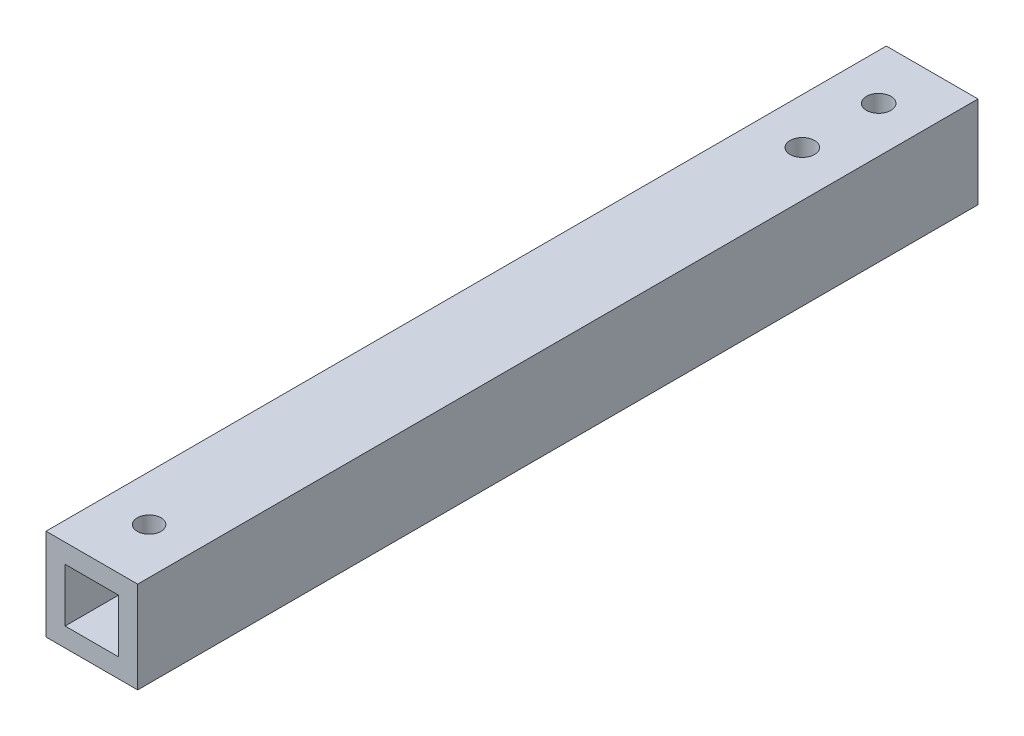
ISO-10303-21;
HEADER;
FILE_DESCRIPTION(('STEP AP214'),'2;1');
FILE_NAME('part.step','',(''),(''),'','','');
FILE_SCHEMA(('AUTOMOTIVE_DESIGN { 1 0 10303 214 1 1 1 1 }'));
ENDSEC;
DATA;
#1=APPLICATION_CONTEXT('core data for automotive mechanical design processes');
#2=APPLICATION_PROTOCOL_DEFINITION('international standard','automotive_design',2000,#1);
#3=PRODUCT_CONTEXT('',#1,'mechanical');
#4=PRODUCT('Part','Part','',(#3));
#5=PRODUCT_RELATED_PRODUCT_CATEGORY('part','',(#4));
#6=PRODUCT_DEFINITION_FORMATION('','',#4);
#7=PRODUCT_DEFINITION_CONTEXT('part definition',#1,'design');
#8=PRODUCT_DEFINITION('design','',#6,#7);
#9=PRODUCT_DEFINITION_SHAPE('','',#8);
#10=(LENGTH_UNIT() NAMED_UNIT(*) SI_UNIT(.MILLI.,.METRE.));
#11=(NAMED_UNIT(*) PLANE_ANGLE_UNIT() SI_UNIT($,.RADIAN.));
#12=(NAMED_UNIT(*) SI_UNIT($,.STERADIAN.) SOLID_ANGLE_UNIT());
#13=UNCERTAINTY_MEASURE_WITH_UNIT(LENGTH_MEASURE(1.E-05),#10,'distance_accuracy_value','');
#14=(GEOMETRIC_REPRESENTATION_CONTEXT(3) GLOBAL_UNCERTAINTY_ASSIGNED_CONTEXT((#13)) GLOBAL_UNIT_ASSIGNED_CONTEXT((#10,
#11,#12)) REPRESENTATION_CONTEXT('',''));
#15=CARTESIAN_POINT('',(0.,0.,0.));
#16=DIRECTION('',(0.,0.,1.));
#17=DIRECTION('',(1.,0.,0.));
#18=AXIS2_PLACEMENT_3D('',#15,#16,#17);
#19=CARTESIAN_POINT('',(6.,-6.,110.));
#20=DIRECTION('',(-1.,0.,0.));
#21=DIRECTION('',(0.,0.,1.));
#22=AXIS2_PLACEMENT_3D('',#19,#20,#21);
#23=PLANE('',#22);
#24=DIRECTION('',(0.,1.,0.));
#25=VECTOR('',#24,1.);
#26=CARTESIAN_POINT('',(6.,-6.,0.));
#27=LINE('',#26,#25);
#28=CARTESIAN_POINT('',(6.,-6.,0.));
#29=VERTEX_POINT('',#28);
#30=CARTESIAN_POINT('',(6.,6.,0.));
#31=VERTEX_POINT('',#30);
#32=EDGE_CURVE('E152',#29,#31,#27,.T.);
#33=ORIENTED_EDGE('',*,*,#32,.T.);
#34=DIRECTION('',(0.,0.,-1.));
#35=VECTOR('',#34,1.);
#36=CARTESIAN_POINT('',(6.,6.,110.));
#37=LINE('',#36,#35);
#38=CARTESIAN_POINT('',(6.,6.,110.));
#39=VERTEX_POINT('',#38);
#40=EDGE_CURVE('E11',#39,#31,#37,.T.);
#41=ORIENTED_EDGE('',*,*,#40,.F.);
#42=DIRECTION('',(0.,1.,0.));
#43=VECTOR('',#42,1.);
#44=CARTESIAN_POINT('',(6.,-6.,110.));
#45=LINE('',#44,#43);
#46=CARTESIAN_POINT('',(6.,-6.,110.));
#47=VERTEX_POINT('',#46);
#48=EDGE_CURVE('E158',#47,#39,#45,.T.);
#49=ORIENTED_EDGE('',*,*,#48,.F.);
#50=DIRECTION('',(0.,0.,-1.));
#51=VECTOR('',#50,1.);
#52=CARTESIAN_POINT('',(6.,-6.,110.));
#53=LINE('',#52,#51);
#54=EDGE_CURVE('E172',#47,#29,#53,.T.);
#55=ORIENTED_EDGE('',*,*,#54,.T.);
#56=EDGE_LOOP('',(#33,#41,#49,#55));
#57=FACE_BOUND('',#56,.T.);
#58=ADVANCED_FACE('F39',(#57),#23,.F.);
#59=CARTESIAN_POINT('',(-6.,6.,110.));
#60=DIRECTION('',(0.,-1.,0.));
#61=DIRECTION('',(0.,0.,-1.));
#62=AXIS2_PLACEMENT_3D('',#59,#60,#61);
#63=PLANE('',#62);
#64=CARTESIAN_POINT('',(0.,6.,7.));
#65=DIRECTION('',(0.,-1.,0.));
#66=DIRECTION('',(0.,0.,-1.));
#67=AXIS2_PLACEMENT_3D('',#64,#65,#66);
#68=CIRCLE('',#67,1.6);
#69=CARTESIAN_POINT('',(0.,6.,5.4));
#70=VERTEX_POINT('',#69);
#71=EDGE_CURVE('E198',#70,#70,#68,.T.);
#72=ORIENTED_EDGE('',*,*,#71,.T.);
#73=EDGE_LOOP('',(#72));
#74=FACE_BOUND('',#73,.T.);
#75=CARTESIAN_POINT('',(0.,6.,17.));
#76=DIRECTION('',(0.,-1.,0.));
#77=DIRECTION('',(0.,0.,-1.));
#78=AXIS2_PLACEMENT_3D('',#75,#76,#77);
#79=CIRCLE('',#78,1.6);
#80=CARTESIAN_POINT('',(0.,6.,15.4));
#81=VERTEX_POINT('',#80);
#82=EDGE_CURVE('E225',#81,#81,#79,.T.);
#83=ORIENTED_EDGE('',*,*,#82,.T.);
#84=EDGE_LOOP('',(#83));
#85=FACE_BOUND('',#84,.T.);
#86=CARTESIAN_POINT('',(0.,6.,102.5));
#87=DIRECTION('',(0.,-1.,0.));
#88=DIRECTION('',(0.,0.,-1.));
#89=AXIS2_PLACEMENT_3D('',#86,#87,#88);
#90=CIRCLE('',#89,1.55);
#91=CARTESIAN_POINT('',(0.,6.,100.95));
#92=VERTEX_POINT('',#91);
#93=EDGE_CURVE('E217',#92,#92,#90,.T.);
#94=ORIENTED_EDGE('',*,*,#93,.T.);
#95=EDGE_LOOP('',(#94));
#96=FACE_BOUND('',#95,.T.);
#97=DIRECTION('',(-1.,0.,0.));
#98=VECTOR('',#97,1.);
#99=CARTESIAN_POINT('',(-6.,6.,0.));
#100=LINE('',#99,#98);
#101=CARTESIAN_POINT('',(-6.,6.,0.));
#102=VERTEX_POINT('',#101);
#103=EDGE_CURVE('E176',#31,#102,#100,.T.);
#104=ORIENTED_EDGE('',*,*,#103,.T.);
#105=DIRECTION('',(0.,0.,-1.));
#106=VECTOR('',#105,1.);
#107=CARTESIAN_POINT('',(-6.,6.,110.));
#108=LINE('',#107,#106);
#109=CARTESIAN_POINT('',(-6.,6.,110.));
#110=VERTEX_POINT('',#109);
#111=EDGE_CURVE('E48',#110,#102,#108,.T.);
#112=ORIENTED_EDGE('',*,*,#111,.F.);
#113=DIRECTION('',(-1.,0.,0.));
#114=VECTOR('',#113,1.);
#115=CARTESIAN_POINT('',(-6.,6.,110.));
#116=LINE('',#115,#114);
#117=EDGE_CURVE('E162',#39,#110,#116,.T.);
#118=ORIENTED_EDGE('',*,*,#117,.F.);
#119=ORIENTED_EDGE('',*,*,#40,.T.);
#120=EDGE_LOOP('',(#104,#112,#118,#119));
#121=FACE_BOUND('',#120,.T.);
#122=ADVANCED_FACE('F237',(#74,#85,#96,#121),#63,.F.);
#123=CARTESIAN_POINT('',(-6.,-6.,110.));
#124=DIRECTION('',(1.,0.,0.));
#125=DIRECTION('',(0.,0.,-1.));
#126=AXIS2_PLACEMENT_3D('',#123,#124,#125);
#127=PLANE('',#126);
#128=DIRECTION('',(0.,-1.,0.));
#129=VECTOR('',#128,1.);
#130=CARTESIAN_POINT('',(-6.,-6.,0.));
#131=LINE('',#130,#129);
#132=CARTESIAN_POINT('',(-6.,-6.,0.));
#133=VERTEX_POINT('',#132);
#134=EDGE_CURVE('E179',#102,#133,#131,.T.);
#135=ORIENTED_EDGE('',*,*,#134,.T.);
#136=DIRECTION('',(0.,0.,-1.));
#137=VECTOR('',#136,1.);
#138=CARTESIAN_POINT('',(-6.,-6.,110.));
#139=LINE('',#138,#137);
#140=CARTESIAN_POINT('',(-6.,-6.,110.));
#141=VERTEX_POINT('',#140);
#142=EDGE_CURVE('E187',#141,#133,#139,.T.);
#143=ORIENTED_EDGE('',*,*,#142,.F.);
#144=DIRECTION('',(0.,-1.,0.));
#145=VECTOR('',#144,1.);
#146=CARTESIAN_POINT('',(-6.,-6.,110.));
#147=LINE('',#146,#145);
#148=EDGE_CURVE('E166',#110,#141,#147,.T.);
#149=ORIENTED_EDGE('',*,*,#148,.F.);
#150=ORIENTED_EDGE('',*,*,#111,.T.);
#151=EDGE_LOOP('',(#135,#143,#149,#150));
#152=FACE_BOUND('',#151,.T.);
#153=ADVANCED_FACE('F273',(#152),#127,.F.);
#154=CARTESIAN_POINT('',(-6.,-6.,110.));
#155=DIRECTION('',(0.,1.,0.));
#156=DIRECTION('',(0.,0.,1.));
#157=AXIS2_PLACEMENT_3D('',#154,#155,#156);
#158=PLANE('',#157);
#159=CARTESIAN_POINT('',(0.,-6.,7.));
#160=DIRECTION('',(0.,-1.,0.));
#161=DIRECTION('',(0.,0.,-1.));
#162=AXIS2_PLACEMENT_3D('',#159,#160,#161);
#163=CIRCLE('',#162,1.6);
#164=CARTESIAN_POINT('',(0.,-6.,5.4));
#165=VERTEX_POINT('',#164);
#166=EDGE_CURVE('E229',#165,#165,#163,.T.);
#167=ORIENTED_EDGE('',*,*,#166,.F.);
#168=EDGE_LOOP('',(#167));
#169=FACE_BOUND('',#168,.T.);
#170=CARTESIAN_POINT('',(0.,-6.,17.));
#171=DIRECTION('',(0.,-1.,0.));
#172=DIRECTION('',(0.,0.,-1.));
#173=AXIS2_PLACEMENT_3D('',#170,#171,#172);
#174=CIRCLE('',#173,1.6);
#175=CARTESIAN_POINT('',(0.,-6.,15.4));
#176=VERTEX_POINT('',#175);
#177=EDGE_CURVE('E221',#176,#176,#174,.T.);
#178=ORIENTED_EDGE('',*,*,#177,.F.);
#179=EDGE_LOOP('',(#178));
#180=FACE_BOUND('',#179,.T.);
#181=CARTESIAN_POINT('',(0.,-6.,102.5));
#182=DIRECTION('',(0.,-1.,0.));
#183=DIRECTION('',(0.,0.,-1.));
#184=AXIS2_PLACEMENT_3D('',#181,#182,#183);
#185=CIRCLE('',#184,1.55);
#186=CARTESIAN_POINT('',(0.,-6.,100.95));
#187=VERTEX_POINT('',#186);
#188=EDGE_CURVE('E213',#187,#187,#185,.T.);
#189=ORIENTED_EDGE('',*,*,#188,.F.);
#190=EDGE_LOOP('',(#189));
#191=FACE_BOUND('',#190,.T.);
#192=DIRECTION('',(1.,0.,0.));
#193=VECTOR('',#192,1.);
#194=CARTESIAN_POINT('',(-6.,-6.,0.));
#195=LINE('',#194,#193);
#196=EDGE_CURVE('E163',#133,#29,#195,.T.);
#197=ORIENTED_EDGE('',*,*,#196,.T.);
#198=ORIENTED_EDGE('',*,*,#54,.F.);
#199=DIRECTION('',(1.,0.,0.));
#200=VECTOR('',#199,1.);
#201=CARTESIAN_POINT('',(-6.,-6.,110.));
#202=LINE('',#201,#200);
#203=EDGE_CURVE('E169',#141,#47,#202,.T.);
#204=ORIENTED_EDGE('',*,*,#203,.F.);
#205=ORIENTED_EDGE('',*,*,#142,.T.);
#206=EDGE_LOOP('',(#197,#198,#204,#205));
#207=FACE_BOUND('',#206,.T.);
#208=ADVANCED_FACE('F288',(#169,#180,#191,#207),#158,.F.);
#209=CARTESIAN_POINT('',(0.,0.,110.));
#210=DIRECTION('',(0.,0.,-1.));
#211=DIRECTION('',(-1.,0.,0.));
#212=AXIS2_PLACEMENT_3D('',#209,#210,#211);
#213=PLANE('',#212);
#214=DIRECTION('',(1.,0.,0.));
#215=VECTOR('',#214,1.);
#216=CARTESIAN_POINT('',(3.5,-3.5,110.));
#217=LINE('',#216,#215);
#218=CARTESIAN_POINT('',(-3.5,-3.5,110.));
#219=VERTEX_POINT('',#218);
#220=CARTESIAN_POINT('',(3.5,-3.5,110.));
#221=VERTEX_POINT('',#220);
#222=EDGE_CURVE('E143',#219,#221,#217,.T.);
#223=ORIENTED_EDGE('',*,*,#222,.F.);
#224=DIRECTION('',(0.,-1.,0.));
#225=VECTOR('',#224,1.);
#226=CARTESIAN_POINT('',(-3.5,-3.5,110.));
#227=LINE('',#226,#225);
#228=CARTESIAN_POINT('',(-3.5,3.5,110.));
#229=VERTEX_POINT('',#228);
#230=EDGE_CURVE('E56',#229,#219,#227,.T.);
#231=ORIENTED_EDGE('',*,*,#230,.F.);
#232=DIRECTION('',(-1.,0.,0.));
#233=VECTOR('',#232,1.);
#234=CARTESIAN_POINT('',(3.5,3.5,110.));
#235=LINE('',#234,#233);
#236=CARTESIAN_POINT('',(3.5,3.5,110.));
#237=VERTEX_POINT('',#236);
#238=EDGE_CURVE('E127',#237,#229,#235,.T.);
#239=ORIENTED_EDGE('',*,*,#238,.F.);
#240=DIRECTION('',(0.,1.,0.));
#241=VECTOR('',#240,1.);
#242=CARTESIAN_POINT('',(3.5,-3.5,110.));
#243=LINE('',#242,#241);
#244=EDGE_CURVE('E131',#221,#237,#243,.T.);
#245=ORIENTED_EDGE('',*,*,#244,.F.);
#246=EDGE_LOOP('',(#223,#231,#239,#245));
#247=FACE_BOUND('',#246,.T.);
#248=ORIENTED_EDGE('',*,*,#48,.T.);
#249=ORIENTED_EDGE('',*,*,#117,.T.);
#250=ORIENTED_EDGE('',*,*,#148,.T.);
#251=ORIENTED_EDGE('',*,*,#203,.T.);
#252=EDGE_LOOP('',(#248,#249,#250,#251));
#253=FACE_BOUND('',#252,.T.);
#254=ADVANCED_FACE('F284',(#247,#253),#213,.F.);
#255=CARTESIAN_POINT('',(0.,0.,0.));
#256=DIRECTION('',(0.,0.,-1.));
#257=DIRECTION('',(-1.,0.,0.));
#258=AXIS2_PLACEMENT_3D('',#255,#256,#257);
#259=PLANE('',#258);
#260=DIRECTION('',(0.,-1.,0.));
#261=VECTOR('',#260,1.);
#262=CARTESIAN_POINT('',(-3.5,-3.5,0.));
#263=LINE('',#262,#261);
#264=CARTESIAN_POINT('',(-3.5,3.5,0.));
#265=VERTEX_POINT('',#264);
#266=CARTESIAN_POINT('',(-3.5,-3.5,0.));
#267=VERTEX_POINT('',#266);
#268=EDGE_CURVE('E108',#265,#267,#263,.T.);
#269=ORIENTED_EDGE('',*,*,#268,.T.);
#270=DIRECTION('',(1.,0.,0.));
#271=VECTOR('',#270,1.);
#272=CARTESIAN_POINT('',(3.5,-3.5,0.));
#273=LINE('',#272,#271);
#274=CARTESIAN_POINT('',(3.5,-3.5,0.));
#275=VERTEX_POINT('',#274);
#276=EDGE_CURVE('E118',#267,#275,#273,.T.);
#277=ORIENTED_EDGE('',*,*,#276,.T.);
#278=DIRECTION('',(0.,1.,0.));
#279=VECTOR('',#278,1.);
#280=CARTESIAN_POINT('',(3.5,-3.5,0.));
#281=LINE('',#280,#279);
#282=CARTESIAN_POINT('',(3.5,3.5,0.));
#283=VERTEX_POINT('',#282);
#284=EDGE_CURVE('E64',#275,#283,#281,.T.);
#285=ORIENTED_EDGE('',*,*,#284,.T.);
#286=DIRECTION('',(-1.,0.,0.));
#287=VECTOR('',#286,1.);
#288=CARTESIAN_POINT('',(3.5,3.5,0.));
#289=LINE('',#288,#287);
#290=EDGE_CURVE('E115',#283,#265,#289,.T.);
#291=ORIENTED_EDGE('',*,*,#290,.T.);
#292=EDGE_LOOP('',(#269,#277,#285,#291));
#293=FACE_BOUND('',#292,.T.);
#294=ORIENTED_EDGE('',*,*,#32,.F.);
#295=ORIENTED_EDGE('',*,*,#196,.F.);
#296=ORIENTED_EDGE('',*,*,#134,.F.);
#297=ORIENTED_EDGE('',*,*,#103,.F.);
#298=EDGE_LOOP('',(#294,#295,#296,#297));
#299=FACE_BOUND('',#298,.T.);
#300=ADVANCED_FACE('F123',(#293,#299),#259,.T.);
#301=CARTESIAN_POINT('',(-3.5,-3.5,0.));
#302=DIRECTION('',(-1.,0.,0.));
#303=DIRECTION('',(0.,-1.,0.));
#304=AXIS2_PLACEMENT_3D('',#301,#302,#303);
#305=PLANE('',#304);
#306=ORIENTED_EDGE('',*,*,#230,.T.);
#307=DIRECTION('',(0.,0.,1.));
#308=VECTOR('',#307,1.);
#309=CARTESIAN_POINT('',(-3.5,-3.5,0.));
#310=LINE('',#309,#308);
#311=EDGE_CURVE('E104',#267,#219,#310,.T.);
#312=ORIENTED_EDGE('',*,*,#311,.F.);
#313=ORIENTED_EDGE('',*,*,#268,.F.);
#314=DIRECTION('',(0.,0.,1.));
#315=VECTOR('',#314,1.);
#316=CARTESIAN_POINT('',(-3.5,3.5,0.));
#317=LINE('',#316,#315);
#318=EDGE_CURVE('E149',#265,#229,#317,.T.);
#319=ORIENTED_EDGE('',*,*,#318,.T.);
#320=EDGE_LOOP('',(#306,#312,#313,#319));
#321=FACE_BOUND('',#320,.T.);
#322=ADVANCED_FACE('F106',(#321),#305,.F.);
#323=CARTESIAN_POINT('',(3.5,3.5,0.));
#324=DIRECTION('',(0.,1.,0.));
#325=DIRECTION('',(-1.,0.,0.));
#326=AXIS2_PLACEMENT_3D('',#323,#324,#325);
#327=PLANE('',#326);
#328=CARTESIAN_POINT('',(0.,3.5,7.));
#329=DIRECTION('',(0.,1.,0.));
#330=DIRECTION('',(-1.,0.,0.));
#331=AXIS2_PLACEMENT_3D('',#328,#329,#330);
#332=CIRCLE('',#331,1.6);
#333=CARTESIAN_POINT('',(-1.6,3.5,7.));
#334=VERTEX_POINT('',#333);
#335=EDGE_CURVE('E134',#334,#334,#332,.T.);
#336=ORIENTED_EDGE('',*,*,#335,.T.);
#337=EDGE_LOOP('',(#336));
#338=FACE_BOUND('',#337,.T.);
#339=CARTESIAN_POINT('',(0.,3.5,17.));
#340=DIRECTION('',(0.,1.,0.));
#341=DIRECTION('',(-1.,0.,0.));
#342=AXIS2_PLACEMENT_3D('',#339,#340,#341);
#343=CIRCLE('',#342,1.6);
#344=CARTESIAN_POINT('',(-1.6,3.5,17.));
#345=VERTEX_POINT('',#344);
#346=EDGE_CURVE('E202',#345,#345,#343,.T.);
#347=ORIENTED_EDGE('',*,*,#346,.T.);
#348=EDGE_LOOP('',(#347));
#349=FACE_BOUND('',#348,.T.);
#350=CARTESIAN_POINT('',(0.,3.5,102.5));
#351=DIRECTION('',(0.,1.,0.));
#352=DIRECTION('',(-1.,0.,0.));
#353=AXIS2_PLACEMENT_3D('',#350,#351,#352);
#354=CIRCLE('',#353,1.55);
#355=CARTESIAN_POINT('',(-1.55,3.5,102.5));
#356=VERTEX_POINT('',#355);
#357=EDGE_CURVE('E197',#356,#356,#354,.T.);
#358=ORIENTED_EDGE('',*,*,#357,.T.);
#359=EDGE_LOOP('',(#358));
#360=FACE_BOUND('',#359,.T.);
#361=ORIENTED_EDGE('',*,*,#238,.T.);
#362=ORIENTED_EDGE('',*,*,#318,.F.);
#363=ORIENTED_EDGE('',*,*,#290,.F.);
#364=DIRECTION('',(0.,0.,1.));
#365=VECTOR('',#364,1.);
#366=CARTESIAN_POINT('',(3.5,3.5,0.));
#367=LINE('',#366,#365);
#368=EDGE_CURVE('E153',#283,#237,#367,.T.);
#369=ORIENTED_EDGE('',*,*,#368,.T.);
#370=EDGE_LOOP('',(#361,#362,#363,#369));
#371=FACE_BOUND('',#370,.T.);
#372=ADVANCED_FACE('F305',(#338,#349,#360,#371),#327,.F.);
#373=CARTESIAN_POINT('',(3.5,-3.5,0.));
#374=DIRECTION('',(1.,0.,0.));
#375=DIRECTION('',(0.,0.,-1.));
#376=AXIS2_PLACEMENT_3D('',#373,#374,#375);
#377=PLANE('',#376);
#378=ORIENTED_EDGE('',*,*,#244,.T.);
#379=ORIENTED_EDGE('',*,*,#368,.F.);
#380=ORIENTED_EDGE('',*,*,#284,.F.);
#381=DIRECTION('',(0.,0.,1.));
#382=VECTOR('',#381,1.);
#383=CARTESIAN_POINT('',(3.5,-3.5,0.));
#384=LINE('',#383,#382);
#385=EDGE_CURVE('E114',#275,#221,#384,.T.);
#386=ORIENTED_EDGE('',*,*,#385,.T.);
#387=EDGE_LOOP('',(#378,#379,#380,#386));
#388=FACE_BOUND('',#387,.T.);
#389=ADVANCED_FACE('F308',(#388),#377,.F.);
#390=CARTESIAN_POINT('',(3.5,-3.5,0.));
#391=DIRECTION('',(0.,-1.,0.));
#392=DIRECTION('',(1.,0.,0.));
#393=AXIS2_PLACEMENT_3D('',#390,#391,#392);
#394=PLANE('',#393);
#395=CARTESIAN_POINT('',(0.,-3.5,7.));
#396=DIRECTION('',(0.,-1.,0.));
#397=DIRECTION('',(1.,0.,0.));
#398=AXIS2_PLACEMENT_3D('',#395,#396,#397);
#399=CIRCLE('',#398,1.6);
#400=CARTESIAN_POINT('',(1.6,-3.5,7.));
#401=VERTEX_POINT('',#400);
#402=EDGE_CURVE('E42',#401,#401,#399,.T.);
#403=ORIENTED_EDGE('',*,*,#402,.T.);
#404=EDGE_LOOP('',(#403));
#405=FACE_BOUND('',#404,.T.);
#406=CARTESIAN_POINT('',(0.,-3.5,17.));
#407=DIRECTION('',(0.,-1.,0.));
#408=DIRECTION('',(1.,0.,0.));
#409=AXIS2_PLACEMENT_3D('',#406,#407,#408);
#410=CIRCLE('',#409,1.6);
#411=CARTESIAN_POINT('',(1.6,-3.5,17.));
#412=VERTEX_POINT('',#411);
#413=EDGE_CURVE('E199',#412,#412,#410,.T.);
#414=ORIENTED_EDGE('',*,*,#413,.T.);
#415=EDGE_LOOP('',(#414));
#416=FACE_BOUND('',#415,.T.);
#417=CARTESIAN_POINT('',(0.,-3.5,102.5));
#418=DIRECTION('',(0.,-1.,0.));
#419=DIRECTION('',(1.,0.,0.));
#420=AXIS2_PLACEMENT_3D('',#417,#418,#419);
#421=CIRCLE('',#420,1.55);
#422=CARTESIAN_POINT('',(1.55,-3.5,102.5));
#423=VERTEX_POINT('',#422);
#424=EDGE_CURVE('E194',#423,#423,#421,.T.);
#425=ORIENTED_EDGE('',*,*,#424,.T.);
#426=EDGE_LOOP('',(#425));
#427=FACE_BOUND('',#426,.T.);
#428=ORIENTED_EDGE('',*,*,#222,.T.);
#429=ORIENTED_EDGE('',*,*,#385,.F.);
#430=ORIENTED_EDGE('',*,*,#276,.F.);
#431=ORIENTED_EDGE('',*,*,#311,.T.);
#432=EDGE_LOOP('',(#428,#429,#430,#431));
#433=FACE_BOUND('',#432,.T.);
#434=ADVANCED_FACE('F119',(#405,#416,#427,#433),#394,.F.);
#435=CARTESIAN_POINT('',(0.,6.,102.5));
#436=DIRECTION('',(0.,-1.,0.));
#437=DIRECTION('',(0.,0.,-1.));
#438=AXIS2_PLACEMENT_3D('',#435,#436,#437);
#439=CYLINDRICAL_SURFACE('',#438,1.55);
#440=ORIENTED_EDGE('',*,*,#188,.T.);
#441=EDGE_LOOP('',(#440));
#442=FACE_BOUND('',#441,.T.);
#443=ORIENTED_EDGE('',*,*,#424,.F.);
#444=EDGE_LOOP('',(#443));
#445=FACE_BOUND('',#444,.T.);
#446=ADVANCED_FACE('F265',(#442,#445),#439,.F.);
#447=CARTESIAN_POINT('',(0.,6.,17.));
#448=DIRECTION('',(0.,-1.,0.));
#449=DIRECTION('',(0.,0.,-1.));
#450=AXIS2_PLACEMENT_3D('',#447,#448,#449);
#451=CYLINDRICAL_SURFACE('',#450,1.6);
#452=ORIENTED_EDGE('',*,*,#177,.T.);
#453=EDGE_LOOP('',(#452));
#454=FACE_BOUND('',#453,.T.);
#455=ORIENTED_EDGE('',*,*,#413,.F.);
#456=EDGE_LOOP('',(#455));
#457=FACE_BOUND('',#456,.T.);
#458=ADVANCED_FACE('F257',(#454,#457),#451,.F.);
#459=CARTESIAN_POINT('',(0.,6.,7.));
#460=DIRECTION('',(0.,-1.,0.));
#461=DIRECTION('',(0.,0.,-1.));
#462=AXIS2_PLACEMENT_3D('',#459,#460,#461);
#463=CYLINDRICAL_SURFACE('',#462,1.6);
#464=ORIENTED_EDGE('',*,*,#166,.T.);
#465=EDGE_LOOP('',(#464));
#466=FACE_BOUND('',#465,.T.);
#467=ORIENTED_EDGE('',*,*,#402,.F.);
#468=EDGE_LOOP('',(#467));
#469=FACE_BOUND('',#468,.T.);
#470=ADVANCED_FACE('F245',(#466,#469),#463,.F.);
#471=ORIENTED_EDGE('',*,*,#93,.F.);
#472=EDGE_LOOP('',(#471));
#473=FACE_BOUND('',#472,.T.);
#474=ORIENTED_EDGE('',*,*,#357,.F.);
#475=EDGE_LOOP('',(#474));
#476=FACE_BOUND('',#475,.T.);
#477=ADVANCED_FACE('F256',(#473,#476),#439,.F.);
#478=ORIENTED_EDGE('',*,*,#82,.F.);
#479=EDGE_LOOP('',(#478));
#480=FACE_BOUND('',#479,.T.);
#481=ORIENTED_EDGE('',*,*,#346,.F.);
#482=EDGE_LOOP('',(#481));
#483=FACE_BOUND('',#482,.T.);
#484=ADVANCED_FACE('F243',(#480,#483),#451,.F.);
#485=ORIENTED_EDGE('',*,*,#71,.F.);
#486=EDGE_LOOP('',(#485));
#487=FACE_BOUND('',#486,.T.);
#488=ORIENTED_EDGE('',*,*,#335,.F.);
#489=EDGE_LOOP('',(#488));
#490=FACE_BOUND('',#489,.T.);
#491=ADVANCED_FACE('F240',(#487,#490),#463,.F.);
#492=CLOSED_SHELL('',(#58,#122,#153,#208,#254,#300,#322,#372,#389,#434,#446,#458,#470,#477,#484,#491));
#493=MANIFOLD_SOLID_BREP('B2',#492);
#494=ADVANCED_BREP_SHAPE_REPRESENTATION('',(#18,#493),#14);
#495=SHAPE_DEFINITION_REPRESENTATION(#9,#494);
ENDSEC;
END-ISO-10303-21;
